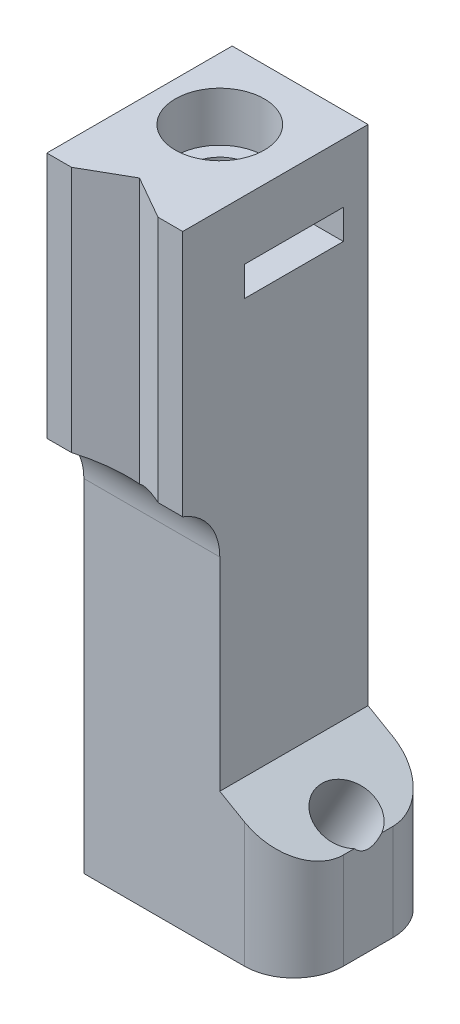
ISO-10303-21;
HEADER;
FILE_DESCRIPTION(('STEP AP214'),'2;1');
FILE_NAME('part.step','',(''),(''),'','','');
FILE_SCHEMA(('AUTOMOTIVE_DESIGN { 1 0 10303 214 1 1 1 1 }'));
ENDSEC;
DATA;
#1=APPLICATION_CONTEXT('core data for automotive mechanical design processes');
#2=APPLICATION_PROTOCOL_DEFINITION('international standard','automotive_design',2000,#1);
#3=PRODUCT_CONTEXT('',#1,'mechanical');
#4=PRODUCT('Part','Part','',(#3));
#5=PRODUCT_RELATED_PRODUCT_CATEGORY('part','',(#4));
#6=PRODUCT_DEFINITION_FORMATION('','',#4);
#7=PRODUCT_DEFINITION_CONTEXT('part definition',#1,'design');
#8=PRODUCT_DEFINITION('design','',#6,#7);
#9=PRODUCT_DEFINITION_SHAPE('','',#8);
#10=(LENGTH_UNIT() NAMED_UNIT(*) SI_UNIT(.MILLI.,.METRE.));
#11=(NAMED_UNIT(*) PLANE_ANGLE_UNIT() SI_UNIT($,.RADIAN.));
#12=(NAMED_UNIT(*) SI_UNIT($,.STERADIAN.) SOLID_ANGLE_UNIT());
#13=UNCERTAINTY_MEASURE_WITH_UNIT(LENGTH_MEASURE(1.E-05),#10,'distance_accuracy_value','');
#14=(GEOMETRIC_REPRESENTATION_CONTEXT(3) GLOBAL_UNCERTAINTY_ASSIGNED_CONTEXT((#13)) GLOBAL_UNIT_ASSIGNED_CONTEXT((#10,
#11,#12)) REPRESENTATION_CONTEXT('',''));
#15=CARTESIAN_POINT('',(0.,0.,0.));
#16=DIRECTION('',(0.,0.,1.));
#17=DIRECTION('',(1.,0.,0.));
#18=AXIS2_PLACEMENT_3D('',#15,#16,#17);
#19=CARTESIAN_POINT('',(2.50000000000003,19.75,0.));
#20=DIRECTION('',(0.,-1.,0.));
#21=DIRECTION('',(1.,0.,0.));
#22=AXIS2_PLACEMENT_3D('',#19,#20,#21);
#23=CYLINDRICAL_SURFACE('',#22,0.605);
#24=CARTESIAN_POINT('',(2.50000000000003,19.55,0.));
#25=DIRECTION('',(0.,1.,0.));
#26=DIRECTION('',(0.,0.,1.));
#27=AXIS2_PLACEMENT_3D('',#24,#25,#26);
#28=CIRCLE('',#27,0.605);
#29=CARTESIAN_POINT('',(2.50000000000003,19.55,0.605000000000023));
#30=VERTEX_POINT('',#29);
#31=EDGE_CURVE('E325',#30,#30,#28,.T.);
#32=ORIENTED_EDGE('',*,*,#31,.F.);
#33=EDGE_LOOP('',(#32));
#34=FACE_BOUND('',#33,.T.);
#35=CARTESIAN_POINT('',(2.50000000000003,19.75,0.));
#36=DIRECTION('',(0.,1.,0.));
#37=DIRECTION('',(-1.,0.,0.));
#38=AXIS2_PLACEMENT_3D('',#35,#36,#37);
#39=CIRCLE('',#38,0.605);
#40=CARTESIAN_POINT('',(1.89500000000003,19.75,0.));
#41=VERTEX_POINT('',#40);
#42=EDGE_CURVE('E361',#41,#41,#39,.T.);
#43=ORIENTED_EDGE('',*,*,#42,.T.);
#44=EDGE_LOOP('',(#43));
#45=FACE_BOUND('',#44,.T.);
#46=ADVANCED_FACE('F39',(#34,#45),#23,.F.);
#47=CARTESIAN_POINT('',(0.,0.,2.24999999996326));
#48=DIRECTION('',(0.,0.,-1.));
#49=DIRECTION('',(-1.,0.,0.));
#50=AXIS2_PLACEMENT_3D('',#47,#48,#49);
#51=PLANE('',#50);
#52=DIRECTION('',(1.,0.,0.));
#53=VECTOR('',#52,1.);
#54=CARTESIAN_POINT('',(4.00000000001019,15.75,2.24999999996326));
#55=LINE('',#54,#53);
#56=CARTESIAN_POINT('',(1.25000000001018,15.75,2.24999999996326));
#57=VERTEX_POINT('',#56);
#58=CARTESIAN_POINT('',(1.75000000001019,15.75,2.24999999996326));
#59=VERTEX_POINT('',#58);
#60=EDGE_CURVE('E380',#57,#59,#55,.T.);
#61=ORIENTED_EDGE('',*,*,#60,.T.);
#62=DIRECTION('',(0.,1.,0.));
#63=VECTOR('',#62,1.);
#64=CARTESIAN_POINT('',(1.75000000001014,0.,2.24999999996326));
#65=LINE('',#64,#63);
#66=CARTESIAN_POINT('',(1.7500000000102,20.75,2.24999999996327));
#67=VERTEX_POINT('',#66);
#68=EDGE_CURVE('E305',#59,#67,#65,.T.);
#69=ORIENTED_EDGE('',*,*,#68,.T.);
#70=DIRECTION('',(-1.,0.,0.));
#71=VECTOR('',#70,1.);
#72=CARTESIAN_POINT('',(4.00000000001018,20.75,2.24999999996326));
#73=LINE('',#72,#71);
#74=CARTESIAN_POINT('',(1.25000000001019,20.75,2.24999999996326));
#75=VERTEX_POINT('',#74);
#76=EDGE_CURVE('E392',#67,#75,#73,.T.);
#77=ORIENTED_EDGE('',*,*,#76,.T.);
#78=DIRECTION('',(0.,-1.,0.));
#79=VECTOR('',#78,1.);
#80=CARTESIAN_POINT('',(1.25000000001019,20.75,2.24999999996326));
#81=LINE('',#80,#79);
#82=EDGE_CURVE('E386',#75,#57,#81,.T.);
#83=ORIENTED_EDGE('',*,*,#82,.T.);
#84=EDGE_LOOP('',(#61,#69,#77,#83));
#85=FACE_BOUND('',#84,.T.);
#86=ADVANCED_FACE('F468',(#85),#51,.F.);
#87=CARTESIAN_POINT('',(0.,19.75,0.));
#88=DIRECTION('',(0.,1.,0.));
#89=DIRECTION('',(-1.,0.,0.));
#90=AXIS2_PLACEMENT_3D('',#87,#88,#89);
#91=PLANE('',#90);
#92=ORIENTED_EDGE('',*,*,#42,.F.);
#93=EDGE_LOOP('',(#92));
#94=FACE_BOUND('',#93,.T.);
#95=CARTESIAN_POINT('',(2.50000000000002,19.75,0.));
#96=DIRECTION('',(0.,1.,0.));
#97=DIRECTION('',(-1.,0.,0.));
#98=AXIS2_PLACEMENT_3D('',#95,#96,#97);
#99=CIRCLE('',#98,0.9);
#100=CARTESIAN_POINT('',(1.60000000000002,19.75,0.));
#101=VERTEX_POINT('',#100);
#102=EDGE_CURVE('E377',#101,#101,#99,.T.);
#103=ORIENTED_EDGE('',*,*,#102,.T.);
#104=EDGE_LOOP('',(#103));
#105=FACE_BOUND('',#104,.T.);
#106=ADVANCED_FACE('F480',(#94,#105),#91,.T.);
#107=CARTESIAN_POINT('',(0.,18.75,0.));
#108=DIRECTION('',(0.,1.,0.));
#109=DIRECTION('',(-1.,0.,0.));
#110=AXIS2_PLACEMENT_3D('',#107,#108,#109);
#111=PLANE('',#110);
#112=CARTESIAN_POINT('',(2.50000000000001,18.75,0.));
#113=DIRECTION('',(0.,1.,0.));
#114=DIRECTION('',(-1.,0.,0.));
#115=AXIS2_PLACEMENT_3D('',#112,#113,#114);
#116=CIRCLE('',#115,0.425);
#117=CARTESIAN_POINT('',(2.07500000000001,18.75,0.));
#118=VERTEX_POINT('',#117);
#119=EDGE_CURVE('E253',#118,#118,#116,.T.);
#120=ORIENTED_EDGE('',*,*,#119,.F.);
#121=EDGE_LOOP('',(#120));
#122=FACE_BOUND('',#121,.T.);
#123=CARTESIAN_POINT('',(2.50000000000003,18.75,0.));
#124=DIRECTION('',(0.,1.,0.));
#125=DIRECTION('',(-1.,0.,0.));
#126=AXIS2_PLACEMENT_3D('',#123,#124,#125);
#127=CIRCLE('',#126,0.605);
#128=CARTESIAN_POINT('',(1.89500000000003,18.75,0.));
#129=VERTEX_POINT('',#128);
#130=EDGE_CURVE('E362',#129,#129,#127,.T.);
#131=ORIENTED_EDGE('',*,*,#130,.T.);
#132=EDGE_LOOP('',(#131));
#133=FACE_BOUND('',#132,.T.);
#134=ADVANCED_FACE('F483',(#122,#133),#111,.T.);
#135=CARTESIAN_POINT('',(1.25000000001017,17.75,1.49999999996326));
#136=DIRECTION('',(-1.,0.,0.));
#137=DIRECTION('',(0.,0.,1.));
#138=AXIS2_PLACEMENT_3D('',#135,#136,#137);
#139=PLANE('',#138);
#140=DIRECTION('',(0.,-1.,0.));
#141=VECTOR('',#140,1.);
#142=CARTESIAN_POINT('',(1.25000000001017,18.95,-0.999999999963246));
#143=LINE('',#142,#141);
#144=CARTESIAN_POINT('',(1.25000000001017,19.55,-0.999999999963246));
#145=VERTEX_POINT('',#144);
#146=CARTESIAN_POINT('',(1.25000000001017,18.95,-0.999999999963245));
#147=VERTEX_POINT('',#146);
#148=EDGE_CURVE('E422',#145,#147,#143,.T.);
#149=ORIENTED_EDGE('',*,*,#148,.F.);
#150=DIRECTION('',(0.,0.,-1.));
#151=VECTOR('',#150,1.);
#152=CARTESIAN_POINT('',(1.25000000001017,19.55,-0.999999999963246));
#153=LINE('',#152,#151);
#154=CARTESIAN_POINT('',(1.25000000001017,19.55,1.00000000003675));
#155=VERTEX_POINT('',#154);
#156=EDGE_CURVE('E409',#155,#145,#153,.T.);
#157=ORIENTED_EDGE('',*,*,#156,.F.);
#158=DIRECTION('',(0.,1.,0.));
#159=VECTOR('',#158,1.);
#160=CARTESIAN_POINT('',(1.25000000001017,18.95,1.00000000003675));
#161=LINE('',#160,#159);
#162=CARTESIAN_POINT('',(1.25000000001017,18.95,1.00000000003675));
#163=VERTEX_POINT('',#162);
#164=EDGE_CURVE('E416',#163,#155,#161,.T.);
#165=ORIENTED_EDGE('',*,*,#164,.F.);
#166=DIRECTION('',(0.,0.,1.));
#167=VECTOR('',#166,1.);
#168=CARTESIAN_POINT('',(1.25000000001017,18.95,-0.999999999963246));
#169=LINE('',#168,#167);
#170=EDGE_CURVE('E419',#147,#163,#169,.T.);
#171=ORIENTED_EDGE('',*,*,#170,.F.);
#172=EDGE_LOOP('',(#149,#157,#165,#171));
#173=FACE_BOUND('',#172,.T.);
#174=DIRECTION('',(0.,0.,-1.));
#175=VECTOR('',#174,1.);
#176=CARTESIAN_POINT('',(1.25000000001017,7.75,1.49999999996326));
#177=LINE('',#176,#175);
#178=CARTESIAN_POINT('',(1.25000000001017,7.75,-0.580511210533454));
#179=VERTEX_POINT('',#178);
#180=CARTESIAN_POINT('',(1.25000000001017,7.75,-1.50000000003674));
#181=VERTEX_POINT('',#180);
#182=EDGE_CURVE('E256',#179,#181,#177,.T.);
#183=ORIENTED_EDGE('',*,*,#182,.F.);
#184=DIRECTION('',(0.,1.,0.));
#185=VECTOR('',#184,1.);
#186=CARTESIAN_POINT('',(1.25000000001017,17.75,-0.580511210533454));
#187=LINE('',#186,#185);
#188=CARTESIAN_POINT('',(1.25000000001017,17.75,-0.580511210533454));
#189=VERTEX_POINT('',#188);
#190=EDGE_CURVE('E249',#179,#189,#187,.T.);
#191=ORIENTED_EDGE('',*,*,#190,.T.);
#192=DIRECTION('',(0.,0.,1.));
#193=VECTOR('',#192,1.);
#194=CARTESIAN_POINT('',(1.25000000001017,17.75,1.49999999996326));
#195=LINE('',#194,#193);
#196=CARTESIAN_POINT('',(1.25000000001017,17.75,0.580511210533455));
#197=VERTEX_POINT('',#196);
#198=EDGE_CURVE('E281',#189,#197,#195,.T.);
#199=ORIENTED_EDGE('',*,*,#198,.T.);
#200=DIRECTION('',(0.,-1.,0.));
#201=VECTOR('',#200,1.);
#202=CARTESIAN_POINT('',(1.25000000001017,17.75,0.580511210533455));
#203=LINE('',#202,#201);
#204=CARTESIAN_POINT('',(1.25000000001017,7.75,0.580511210533455));
#205=VERTEX_POINT('',#204);
#206=EDGE_CURVE('E241',#197,#205,#203,.T.);
#207=ORIENTED_EDGE('',*,*,#206,.T.);
#208=CARTESIAN_POINT('',(1.25000000001017,7.75,1.49999999996326));
#209=VERTEX_POINT('',#208);
#210=EDGE_CURVE('E257',#209,#205,#177,.T.);
#211=ORIENTED_EDGE('',*,*,#210,.F.);
#212=DIRECTION('',(0.,-1.,0.));
#213=VECTOR('',#212,1.);
#214=CARTESIAN_POINT('',(1.25000000001017,17.75,1.49999999996326));
#215=LINE('',#214,#213);
#216=CARTESIAN_POINT('',(1.25000000001017,14.6718070673576,1.49999999996326));
#217=VERTEX_POINT('',#216);
#218=EDGE_CURVE('E266',#217,#209,#215,.T.);
#219=ORIENTED_EDGE('',*,*,#218,.F.);
#220=CARTESIAN_POINT('',(1.25000000001017,14.6718070673576,2.64999999996326));
#221=DIRECTION('',(-1.,0.,0.));
#222=DIRECTION('',(0.,0.,1.));
#223=AXIS2_PLACEMENT_3D('',#220,#221,#222);
#224=CIRCLE('',#223,1.15);
#225=EDGE_CURVE('E317',#217,#57,#224,.F.);
#226=ORIENTED_EDGE('',*,*,#225,.T.);
#227=ORIENTED_EDGE('',*,*,#82,.F.);
#228=DIRECTION('',(0.,0.,1.));
#229=VECTOR('',#228,1.);
#230=CARTESIAN_POINT('',(1.25000000001019,20.75,-1.49999999996325));
#231=LINE('',#230,#229);
#232=CARTESIAN_POINT('',(1.25000000001019,20.75,-1.49999999996325));
#233=VERTEX_POINT('',#232);
#234=EDGE_CURVE('E365',#233,#75,#231,.T.);
#235=ORIENTED_EDGE('',*,*,#234,.F.);
#236=DIRECTION('',(0.,-1.,0.));
#237=VECTOR('',#236,1.);
#238=CARTESIAN_POINT('',(1.25000000001017,17.75,-1.50000000003674));
#239=LINE('',#238,#237);
#240=EDGE_CURVE('E265',#233,#181,#239,.T.);
#241=ORIENTED_EDGE('',*,*,#240,.T.);
#242=EDGE_LOOP('',(#183,#191,#199,#207,#211,#219,#226,#227,#235,#241));
#243=FACE_BOUND('',#242,.T.);
#244=ADVANCED_FACE('F541',(#173,#243),#139,.T.);
#245=CARTESIAN_POINT('',(0.,7.75,0.));
#246=DIRECTION('',(0.,1.,0.));
#247=DIRECTION('',(0.,0.,1.));
#248=AXIS2_PLACEMENT_3D('',#245,#246,#247);
#249=PLANE('',#248);
#250=CARTESIAN_POINT('',(2.5,7.75,0.));
#251=DIRECTION('',(0.,1.,0.));
#252=DIRECTION('',(0.,0.,-1.));
#253=AXIS2_PLACEMENT_3D('',#250,#251,#252);
#254=CIRCLE('',#253,0.824999999999999);
#255=CARTESIAN_POINT('',(1.90709641996474,7.75,0.573663965036469));
#256=VERTEX_POINT('',#255);
#257=CARTESIAN_POINT('',(3.25386128245776,7.75,0.335139026093853));
#258=VERTEX_POINT('',#257);
#259=EDGE_CURVE('E242',#256,#258,#254,.T.);
#260=ORIENTED_EDGE('',*,*,#259,.T.);
#261=CARTESIAN_POINT('',(3.79337567298423,7.75,0.));
#262=DIRECTION('',(0.,1.,0.));
#263=DIRECTION('',(1.,0.,0.));
#264=AXIS2_PLACEMENT_3D('',#261,#262,#263);
#265=ELLIPSE('',#264,0.663952809568066,0.575);
#266=CARTESIAN_POINT('',(3.25386128245776,7.75,-0.335139026093852));
#267=VERTEX_POINT('',#266);
#268=EDGE_CURVE('E53',#258,#267,#265,.T.);
#269=ORIENTED_EDGE('',*,*,#268,.T.);
#270=CARTESIAN_POINT('',(1.90709641996474,7.75,-0.573663965036468));
#271=VERTEX_POINT('',#270);
#272=EDGE_CURVE('E245',#267,#271,#254,.T.);
#273=ORIENTED_EDGE('',*,*,#272,.T.);
#274=CARTESIAN_POINT('',(1.76336221874407,7.75,-0.712734017166522));
#275=DIRECTION('',(0.,1.,0.));
#276=DIRECTION('',(0.,0.,1.));
#277=AXIS2_PLACEMENT_3D('',#274,#275,#276);
#278=CIRCLE('',#277,0.2);
#279=CARTESIAN_POINT('',(1.73648991010204,7.75,-0.514547541774664));
#280=VERTEX_POINT('',#279);
#281=EDGE_CURVE('E291',#271,#280,#278,.F.);
#282=ORIENTED_EDGE('',*,*,#281,.T.);
#283=DIRECTION('',(-0.990932376959291,0.,-0.134361543210136));
#284=VECTOR('',#283,1.);
#285=CARTESIAN_POINT('',(0.,7.75,-0.75));
#286=LINE('',#285,#284);
#287=EDGE_CURVE('E236',#280,#179,#286,.T.);
#288=ORIENTED_EDGE('',*,*,#287,.T.);
#289=ORIENTED_EDGE('',*,*,#182,.T.);
#290=DIRECTION('',(1.,0.,2.67195514451353E-11));
#291=VECTOR('',#290,1.);
#292=CARTESIAN_POINT('',(4.00000000001017,7.75,-1.49999999996326));
#293=LINE('',#292,#291);
#294=CARTESIAN_POINT('',(4.50000000003691,7.75,-1.4999999999499));
#295=VERTEX_POINT('',#294);
#296=EDGE_CURVE('E260',#181,#295,#293,.T.);
#297=ORIENTED_EDGE('',*,*,#296,.T.);
#298=CARTESIAN_POINT('',(4.50000000001019,7.75,-0.499999999949901));
#299=DIRECTION('',(0.,1.,0.));
#300=DIRECTION('',(0.,0.,1.));
#301=AXIS2_PLACEMENT_3D('',#298,#299,#300);
#302=CIRCLE('',#301,1.);
#303=CARTESIAN_POINT('',(5.50000000001019,7.75,-0.499999999949901));
#304=VERTEX_POINT('',#303);
#305=EDGE_CURVE('E47',#295,#304,#302,.F.);
#306=ORIENTED_EDGE('',*,*,#305,.T.);
#307=DIRECTION('',(0.,0.,1.));
#308=VECTOR('',#307,1.);
#309=CARTESIAN_POINT('',(5.50000000001019,7.75,-4.69061108165771));
#310=LINE('',#309,#308);
#311=CARTESIAN_POINT('',(5.50000000001019,7.75,0.499999999963262));
#312=VERTEX_POINT('',#311);
#313=EDGE_CURVE('E222',#304,#312,#310,.T.);
#314=ORIENTED_EDGE('',*,*,#313,.T.);
#315=CARTESIAN_POINT('',(4.50000000001019,7.75,0.499999999963261));
#316=DIRECTION('',(0.,1.,0.));
#317=DIRECTION('',(0.,0.,1.));
#318=AXIS2_PLACEMENT_3D('',#315,#316,#317);
#319=CIRCLE('',#318,1.);
#320=CARTESIAN_POINT('',(4.50000000001019,7.75,1.49999999996326));
#321=VERTEX_POINT('',#320);
#322=EDGE_CURVE('E342',#312,#321,#319,.F.);
#323=ORIENTED_EDGE('',*,*,#322,.T.);
#324=DIRECTION('',(-1.,0.,0.));
#325=VECTOR('',#324,1.);
#326=CARTESIAN_POINT('',(4.00000000001017,7.75,1.49999999996326));
#327=LINE('',#326,#325);
#328=EDGE_CURVE('E263',#321,#209,#327,.T.);
#329=ORIENTED_EDGE('',*,*,#328,.T.);
#330=ORIENTED_EDGE('',*,*,#210,.T.);
#331=DIRECTION('',(-0.990932376959291,0.,0.134361543210136));
#332=VECTOR('',#331,1.);
#333=CARTESIAN_POINT('',(0.0998574025388538,7.75,0.736460231779643));
#334=LINE('',#333,#332);
#335=CARTESIAN_POINT('',(1.73648991010204,7.75,0.514547541774664));
#336=VERTEX_POINT('',#335);
#337=EDGE_CURVE('E269',#336,#205,#334,.T.);
#338=ORIENTED_EDGE('',*,*,#337,.F.);
#339=CARTESIAN_POINT('',(1.76336221874407,7.75,0.712734017166523));
#340=DIRECTION('',(0.,1.,0.));
#341=DIRECTION('',(0.,0.,1.));
#342=AXIS2_PLACEMENT_3D('',#339,#340,#341);
#343=CIRCLE('',#342,0.2);
#344=EDGE_CURVE('E289',#336,#256,#343,.F.);
#345=ORIENTED_EDGE('',*,*,#344,.T.);
#346=EDGE_LOOP('',(#260,#269,#273,#282,#288,#289,#297,#306,#314,#323,#329,#330,#338,#345));
#347=FACE_BOUND('',#346,.T.);
#348=ADVANCED_FACE('F346',(#347),#249,.F.);
#349=CARTESIAN_POINT('',(4.00000000001017,17.75,1.49999999996326));
#350=DIRECTION('',(0.,0.,1.));
#351=DIRECTION('',(1.,0.,0.));
#352=AXIS2_PLACEMENT_3D('',#349,#350,#351);
#353=PLANE('',#352);
#354=ORIENTED_EDGE('',*,*,#328,.F.);
#355=DIRECTION('',(0.,1.,0.));
#356=VECTOR('',#355,1.);
#357=CARTESIAN_POINT('',(4.50000000001019,17.75,1.49999999996326));
#358=LINE('',#357,#356);
#359=CARTESIAN_POINT('',(4.50000000001019,10.2773502691896,1.49999999996326));
#360=VERTEX_POINT('',#359);
#361=EDGE_CURVE('E11',#321,#360,#358,.T.);
#362=ORIENTED_EDGE('',*,*,#361,.T.);
#363=DIRECTION('',(-0.866025403784443,0.499999999999993,0.));
#364=VECTOR('',#363,1.);
#365=CARTESIAN_POINT('',(5.5000000000102,9.7,1.49999999996326));
#366=LINE('',#365,#364);
#367=CARTESIAN_POINT('',(4.00000000001018,10.5660254037844,1.49999999996326));
#368=VERTEX_POINT('',#367);
#369=EDGE_CURVE('E226',#360,#368,#366,.T.);
#370=ORIENTED_EDGE('',*,*,#369,.T.);
#371=DIRECTION('',(0.,-1.,0.));
#372=VECTOR('',#371,1.);
#373=CARTESIAN_POINT('',(4.00000000001017,17.75,1.49999999996326));
#374=LINE('',#373,#372);
#375=CARTESIAN_POINT('',(4.00000000001017,14.6718070673576,1.49999999996326));
#376=VERTEX_POINT('',#375);
#377=EDGE_CURVE('E270',#376,#368,#374,.T.);
#378=ORIENTED_EDGE('',*,*,#377,.F.);
#379=DIRECTION('',(1.,0.,0.));
#380=VECTOR('',#379,1.);
#381=CARTESIAN_POINT('',(1.25000000001017,14.6718070673576,1.49999999996326));
#382=LINE('',#381,#380);
#383=EDGE_CURVE('E308',#376,#217,#382,.F.);
#384=ORIENTED_EDGE('',*,*,#383,.T.);
#385=ORIENTED_EDGE('',*,*,#218,.T.);
#386=EDGE_LOOP('',(#354,#362,#370,#378,#384,#385));
#387=FACE_BOUND('',#386,.T.);
#388=ADVANCED_FACE('F546',(#387),#353,.T.);
#389=CARTESIAN_POINT('',(4.00000000001017,17.75,1.49999999996326));
#390=DIRECTION('',(1.,0.,0.));
#391=DIRECTION('',(0.,0.,-1.));
#392=AXIS2_PLACEMENT_3D('',#389,#390,#391);
#393=PLANE('',#392);
#394=DIRECTION('',(0.,1.,0.));
#395=VECTOR('',#394,1.);
#396=CARTESIAN_POINT('',(4.00000000001017,17.75,-0.999999999963246));
#397=LINE('',#396,#395);
#398=CARTESIAN_POINT('',(4.00000000001017,18.95,-0.999999999963246));
#399=VERTEX_POINT('',#398);
#400=CARTESIAN_POINT('',(4.00000000001017,19.55,-0.999999999963246));
#401=VERTEX_POINT('',#400);
#402=EDGE_CURVE('E331',#399,#401,#397,.T.);
#403=ORIENTED_EDGE('',*,*,#402,.F.);
#404=DIRECTION('',(0.,0.,-1.));
#405=VECTOR('',#404,1.);
#406=CARTESIAN_POINT('',(4.00000000001017,18.95,1.49999999996326));
#407=LINE('',#406,#405);
#408=CARTESIAN_POINT('',(4.00000000001017,18.95,1.00000000003675));
#409=VERTEX_POINT('',#408);
#410=EDGE_CURVE('E323',#409,#399,#407,.T.);
#411=ORIENTED_EDGE('',*,*,#410,.F.);
#412=DIRECTION('',(0.,-1.,0.));
#413=VECTOR('',#412,1.);
#414=CARTESIAN_POINT('',(4.00000000001017,17.75,1.00000000003675));
#415=LINE('',#414,#413);
#416=CARTESIAN_POINT('',(4.00000000001017,19.55,1.00000000003675));
#417=VERTEX_POINT('',#416);
#418=EDGE_CURVE('E319',#417,#409,#415,.T.);
#419=ORIENTED_EDGE('',*,*,#418,.F.);
#420=DIRECTION('',(0.,0.,1.));
#421=VECTOR('',#420,1.);
#422=CARTESIAN_POINT('',(4.00000000001017,19.55,1.49999999996326));
#423=LINE('',#422,#421);
#424=EDGE_CURVE('E328',#401,#417,#423,.T.);
#425=ORIENTED_EDGE('',*,*,#424,.F.);
#426=EDGE_LOOP('',(#403,#411,#419,#425));
#427=FACE_BOUND('',#426,.T.);
#428=DIRECTION('',(0.,0.,1.));
#429=VECTOR('',#428,1.);
#430=CARTESIAN_POINT('',(4.00000000001018,10.5660254037844,-4.69061108165771));
#431=LINE('',#430,#429);
#432=CARTESIAN_POINT('',(4.00000000001017,10.5660254037844,-1.49999999996326));
#433=VERTEX_POINT('',#432);
#434=EDGE_CURVE('E229',#433,#368,#431,.T.);
#435=ORIENTED_EDGE('',*,*,#434,.F.);
#436=DIRECTION('',(0.,-1.,0.));
#437=VECTOR('',#436,1.);
#438=CARTESIAN_POINT('',(4.00000000001017,17.75,-1.49999999996326));
#439=LINE('',#438,#437);
#440=CARTESIAN_POINT('',(4.00000000001019,20.75,-1.49999999996325));
#441=VERTEX_POINT('',#440);
#442=EDGE_CURVE('E273',#441,#433,#439,.T.);
#443=ORIENTED_EDGE('',*,*,#442,.F.);
#444=DIRECTION('',(0.,0.,-1.));
#445=VECTOR('',#444,1.);
#446=CARTESIAN_POINT('',(4.00000000001019,20.75,-1.49999999996325));
#447=LINE('',#446,#445);
#448=CARTESIAN_POINT('',(4.00000000001018,20.75,2.24999999996326));
#449=VERTEX_POINT('',#448);
#450=EDGE_CURVE('E373',#449,#441,#447,.T.);
#451=ORIENTED_EDGE('',*,*,#450,.F.);
#452=DIRECTION('',(0.,1.,0.));
#453=VECTOR('',#452,1.);
#454=CARTESIAN_POINT('',(4.00000000001018,20.75,2.24999999996326));
#455=LINE('',#454,#453);
#456=CARTESIAN_POINT('',(4.00000000001019,15.75,2.24999999996326));
#457=VERTEX_POINT('',#456);
#458=EDGE_CURVE('E393',#457,#449,#455,.T.);
#459=ORIENTED_EDGE('',*,*,#458,.F.);
#460=CARTESIAN_POINT('',(4.00000000001017,14.6718070673576,2.64999999996326));
#461=DIRECTION('',(1.,0.,0.));
#462=DIRECTION('',(0.,0.,-1.));
#463=AXIS2_PLACEMENT_3D('',#460,#461,#462);
#464=CIRCLE('',#463,1.15);
#465=EDGE_CURVE('E315',#457,#376,#464,.F.);
#466=ORIENTED_EDGE('',*,*,#465,.T.);
#467=ORIENTED_EDGE('',*,*,#377,.T.);
#468=EDGE_LOOP('',(#435,#443,#451,#459,#466,#467));
#469=FACE_BOUND('',#468,.T.);
#470=ADVANCED_FACE('F552',(#427,#469),#393,.T.);
#471=CARTESIAN_POINT('',(4.00000000001017,17.75,-1.49999999996326));
#472=DIRECTION('',(2.67195514451353E-11,0.,-1.));
#473=DIRECTION('',(-1.,0.,-2.67195514451353E-11));
#474=AXIS2_PLACEMENT_3D('',#471,#472,#473);
#475=PLANE('',#474);
#476=DIRECTION('',(-0.866025403784443,0.499999999999993,-2.31398103292125E-11));
#477=VECTOR('',#476,1.);
#478=CARTESIAN_POINT('',(5.49999999994626,9.70000000003692,-1.49999999992318));
#479=LINE('',#478,#477);
#480=CARTESIAN_POINT('',(4.50000000003691,10.2773502691742,-1.4999999999499));
#481=VERTEX_POINT('',#480);
#482=EDGE_CURVE('E224',#481,#433,#479,.T.);
#483=ORIENTED_EDGE('',*,*,#482,.F.);
#484=DIRECTION('',(0.,1.,0.));
#485=VECTOR('',#484,1.);
#486=CARTESIAN_POINT('',(4.50000000003691,17.75,-1.4999999999499));
#487=LINE('',#486,#485);
#488=EDGE_CURVE('E340',#481,#295,#487,.F.);
#489=ORIENTED_EDGE('',*,*,#488,.T.);
#490=ORIENTED_EDGE('',*,*,#296,.F.);
#491=ORIENTED_EDGE('',*,*,#240,.F.);
#492=DIRECTION('',(-1.,0.,0.));
#493=VECTOR('',#492,1.);
#494=CARTESIAN_POINT('',(4.00000000001019,20.75,-1.49999999996325));
#495=LINE('',#494,#493);
#496=EDGE_CURVE('E370',#441,#233,#495,.T.);
#497=ORIENTED_EDGE('',*,*,#496,.F.);
#498=ORIENTED_EDGE('',*,*,#442,.T.);
#499=EDGE_LOOP('',(#483,#489,#490,#491,#497,#498));
#500=FACE_BOUND('',#499,.T.);
#501=ADVANCED_FACE('F357',(#500),#475,.T.);
#502=CARTESIAN_POINT('',(2.50000000000001,18.75,0.));
#503=DIRECTION('',(0.,-1.,0.));
#504=DIRECTION('',(1.,0.,0.));
#505=AXIS2_PLACEMENT_3D('',#502,#503,#504);
#506=CYLINDRICAL_SURFACE('',#505,0.425);
#507=ORIENTED_EDGE('',*,*,#119,.T.);
#508=EDGE_LOOP('',(#507));
#509=FACE_BOUND('',#508,.T.);
#510=CARTESIAN_POINT('',(2.50000000000001,17.75,0.));
#511=DIRECTION('',(0.,1.,0.));
#512=DIRECTION('',(0.,0.,1.));
#513=AXIS2_PLACEMENT_3D('',#510,#511,#512);
#514=CIRCLE('',#513,0.425);
#515=CARTESIAN_POINT('',(2.50000000000001,17.75,0.425000000000002));
#516=VERTEX_POINT('',#515);
#517=EDGE_CURVE('E252',#516,#516,#514,.F.);
#518=ORIENTED_EDGE('',*,*,#517,.T.);
#519=EDGE_LOOP('',(#518));
#520=FACE_BOUND('',#519,.T.);
#521=ADVANCED_FACE('F505',(#509,#520),#506,.F.);
#522=CARTESIAN_POINT('',(2.5,17.75,0.));
#523=DIRECTION('',(0.,-1.,0.));
#524=DIRECTION('',(0.,0.,-1.));
#525=AXIS2_PLACEMENT_3D('',#522,#523,#524);
#526=CYLINDRICAL_SURFACE('',#525,0.824999999999999);
#527=CARTESIAN_POINT('',(3.25386128245776,7.75,0.335139026093853));
#528=CARTESIAN_POINT('',(3.25811827945143,7.77111145134007,0.32554148059474));
#529=CARTESIAN_POINT('',(3.26237618985324,7.79203851414726,0.315490895272771));
#530=CARTESIAN_POINT('',(3.27087060163928,7.83346444112072,0.294143706094101));
#531=CARTESIAN_POINT('',(3.27510666885029,7.85395862240085,0.282837894462469));
#532=CARTESIAN_POINT('',(3.28365867745061,7.89504882720899,0.258226700738958));
#533=CARTESIAN_POINT('',(3.28796923505354,7.91560562627378,0.244852971195865));
#534=CARTESIAN_POINT('',(3.29633558540741,7.95525746882288,0.216100636082205));
#535=CARTESIAN_POINT('',(3.30039223893617,7.97435750521167,0.200729416591834));
#536=CARTESIAN_POINT('',(3.3068811786802,8.00475583811144,0.172365461038508));
#537=CARTESIAN_POINT('',(3.30943325103671,8.01666468819849,0.160062926805975));
#538=CARTESIAN_POINT('',(3.31415936947011,8.03865387144431,0.133955802069157));
#539=CARTESIAN_POINT('',(3.31633608493243,8.04874714052105,0.120163058618312));
#540=CARTESIAN_POINT('',(3.31949670108628,8.06337210909149,0.0956487923371605));
#541=CARTESIAN_POINT('',(3.3206380138845,8.06864369968799,0.0853948313894527));
#542=CARTESIAN_POINT('',(3.32257028030641,8.07755972822864,0.0641595159964623));
#543=CARTESIAN_POINT('',(3.32336147927492,8.0812053056277,0.0531786771391697));
#544=CARTESIAN_POINT('',(3.32451106354808,8.08649985099804,0.0305834067615678));
#545=CARTESIAN_POINT('',(3.32486475076176,8.08812714672857,0.0189634739441503));
#546=CARTESIAN_POINT('',(3.32507075738345,8.08907515740627,-0.00437514955612568));
#547=CARTESIAN_POINT('',(3.32492327601952,8.08839678891716,-0.0160937991488196));
#548=CARTESIAN_POINT('',(3.32420599420556,8.08509483171219,-0.0375262797973905));
#549=CARTESIAN_POINT('',(3.32369887705464,8.08275994627251,-0.0472892373627826));
#550=CARTESIAN_POINT('',(3.32238349803524,8.07669752546358,-0.0663453282431114));
#551=CARTESIAN_POINT('',(3.32157510025383,8.07296936156009,-0.0756382473634508));
#552=CARTESIAN_POINT('',(3.31915992515662,8.06181618546568,-0.0990567266198876));
#553=CARTESIAN_POINT('',(3.31736498722118,8.05351449699766,-0.112742182378177));
#554=CARTESIAN_POINT('',(3.31336855309429,8.03497759042128,-0.138670077205081));
#555=CARTESIAN_POINT('',(3.31116570433568,8.02473593703016,-0.150907486786668));
#556=CARTESIAN_POINT('',(3.30435312281886,7.9929546603496,-0.184834268167632));
#557=CARTESIAN_POINT('',(3.29939752035186,7.96970764985597,-0.204830208753249));
#558=CARTESIAN_POINT('',(3.28906892407751,7.92085898946442,-0.241571322608408));
#559=CARTESIAN_POINT('',(3.28369431237605,7.89524813437458,-0.25830292315606));
#560=CARTESIAN_POINT('',(3.27421193936738,7.84963382590647,-0.285248119484465));
#561=CARTESIAN_POINT('',(3.27014588007999,7.82994285917185,-0.29601403176555));
#562=CARTESIAN_POINT('',(3.26200673466995,7.79022219707945,-0.316365288634047));
#563=CARTESIAN_POINT('',(3.25793414959498,7.77019805751701,-0.325961622383702));
#564=CARTESIAN_POINT('',(3.25386128245776,7.75,-0.335139026093852));
#565=B_SPLINE_CURVE_WITH_KNOTS('',3,(#527,#528,#529,#530,#531,#532,#533,#534,#535,#536,#537,
#538,#539,#540,#541,#542,#543,#544,#545,#546,#547,#548,#549,#550,#551,#552,#553,#554,#555,#556,
#557,#558,#559,#560,#561,#562,#563,#564),.UNSPECIFIED.,.F.,.F.,(4,2,2,2,2,2,2,2,2,2,2,2,2,2,2,2,
2,2,4),(0.,0.0707590786088178,0.142076599835266,0.216696383892076,0.291047707088388,
0.342874159646891,0.394315307428962,0.428961111740477,0.463582599154878,0.498572719615468,
0.533548932186498,0.563578103031047,0.593620836986706,0.641661779813972,0.689864967823448,
0.782531021828777,0.875574521702547,0.943962360776453,1.01164783934956),.UNSPECIFIED.);
#566=EDGE_CURVE('E216',#258,#267,#565,.T.);
#567=ORIENTED_EDGE('',*,*,#566,.F.);
#568=ORIENTED_EDGE('',*,*,#259,.F.);
#569=DIRECTION('',(0.,-1.,0.));
#570=VECTOR('',#569,1.);
#571=CARTESIAN_POINT('',(1.90709641996474,17.75,0.573663965036469));
#572=LINE('',#571,#570);
#573=CARTESIAN_POINT('',(1.90709641996474,17.75,0.573663965036469));
#574=VERTEX_POINT('',#573);
#575=EDGE_CURVE('E284',#256,#574,#572,.F.);
#576=ORIENTED_EDGE('',*,*,#575,.T.);
#577=CARTESIAN_POINT('',(2.5,17.75,0.));
#578=DIRECTION('',(0.,1.,0.));
#579=DIRECTION('',(0.,0.,-1.));
#580=AXIS2_PLACEMENT_3D('',#577,#578,#579);
#581=CIRCLE('',#580,0.824999999999999);
#582=CARTESIAN_POINT('',(1.90709641996474,17.75,-0.573663965036468));
#583=VERTEX_POINT('',#582);
#584=EDGE_CURVE('E232',#574,#583,#581,.T.);
#585=ORIENTED_EDGE('',*,*,#584,.T.);
#586=DIRECTION('',(0.,-1.,0.));
#587=VECTOR('',#586,1.);
#588=CARTESIAN_POINT('',(1.90709641996474,17.75,-0.573663965036468));
#589=LINE('',#588,#587);
#590=EDGE_CURVE('E286',#583,#271,#589,.T.);
#591=ORIENTED_EDGE('',*,*,#590,.T.);
#592=ORIENTED_EDGE('',*,*,#272,.F.);
#593=EDGE_LOOP('',(#567,#568,#576,#585,#591,#592));
#594=FACE_BOUND('',#593,.T.);
#595=ADVANCED_FACE('F431',(#594),#526,.F.);
#596=CARTESIAN_POINT('',(0.,17.75,-0.75));
#597=DIRECTION('',(-0.134361543210136,0.,0.990932376959291));
#598=DIRECTION('',(0.990932376959291,0.,0.134361543210136));
#599=AXIS2_PLACEMENT_3D('',#596,#597,#598);
#600=PLANE('',#599);
#601=ORIENTED_EDGE('',*,*,#287,.F.);
#602=DIRECTION('',(0.,-1.,0.));
#603=VECTOR('',#602,1.);
#604=CARTESIAN_POINT('',(1.73648991010204,17.75,-0.514547541774664));
#605=LINE('',#604,#603);
#606=CARTESIAN_POINT('',(1.73648991010204,17.75,-0.514547541774664));
#607=VERTEX_POINT('',#606);
#608=EDGE_CURVE('E293',#280,#607,#605,.F.);
#609=ORIENTED_EDGE('',*,*,#608,.T.);
#610=DIRECTION('',(-0.990932376959291,0.,-0.134361543210136));
#611=VECTOR('',#610,1.);
#612=CARTESIAN_POINT('',(0.,17.75,-0.75));
#613=LINE('',#612,#611);
#614=EDGE_CURVE('E235',#607,#189,#613,.T.);
#615=ORIENTED_EDGE('',*,*,#614,.T.);
#616=ORIENTED_EDGE('',*,*,#190,.F.);
#617=EDGE_LOOP('',(#601,#609,#615,#616));
#618=FACE_BOUND('',#617,.T.);
#619=ADVANCED_FACE('F497',(#618),#600,.T.);
#620=CARTESIAN_POINT('',(0.,17.75,0.75));
#621=DIRECTION('',(-0.134361543210136,0.,-0.990932376959291));
#622=DIRECTION('',(-0.990932376959291,0.,0.134361543210136));
#623=AXIS2_PLACEMENT_3D('',#620,#621,#622);
#624=PLANE('',#623);
#625=DIRECTION('',(0.990932376959291,0.,-0.134361543210136));
#626=VECTOR('',#625,1.);
#627=CARTESIAN_POINT('',(0.,17.75,0.75));
#628=LINE('',#627,#626);
#629=CARTESIAN_POINT('',(1.73648991010204,17.75,0.514547541774664));
#630=VERTEX_POINT('',#629);
#631=EDGE_CURVE('E238',#197,#630,#628,.T.);
#632=ORIENTED_EDGE('',*,*,#631,.T.);
#633=DIRECTION('',(0.,-1.,0.));
#634=VECTOR('',#633,1.);
#635=CARTESIAN_POINT('',(1.73648991010204,17.75,0.514547541774664));
#636=LINE('',#635,#634);
#637=EDGE_CURVE('E295',#630,#336,#636,.T.);
#638=ORIENTED_EDGE('',*,*,#637,.T.);
#639=ORIENTED_EDGE('',*,*,#337,.T.);
#640=ORIENTED_EDGE('',*,*,#206,.F.);
#641=EDGE_LOOP('',(#632,#638,#639,#640));
#642=FACE_BOUND('',#641,.T.);
#643=ADVANCED_FACE('F494',(#642),#624,.T.);
#644=CARTESIAN_POINT('',(2.5,17.75,0.));
#645=DIRECTION('',(0.,-1.,0.));
#646=DIRECTION('',(0.,0.,-1.));
#647=AXIS2_PLACEMENT_3D('',#644,#645,#646);
#648=PLANE('',#647);
#649=ORIENTED_EDGE('',*,*,#517,.F.);
#650=EDGE_LOOP('',(#649));
#651=FACE_BOUND('',#650,.T.);
#652=ORIENTED_EDGE('',*,*,#614,.F.);
#653=CARTESIAN_POINT('',(1.76336221874407,17.75,-0.712734017166522));
#654=DIRECTION('',(0.,-1.,0.));
#655=DIRECTION('',(0.,0.,-1.));
#656=AXIS2_PLACEMENT_3D('',#653,#654,#655);
#657=CIRCLE('',#656,0.2);
#658=EDGE_CURVE('E298',#607,#583,#657,.F.);
#659=ORIENTED_EDGE('',*,*,#658,.T.);
#660=ORIENTED_EDGE('',*,*,#584,.F.);
#661=CARTESIAN_POINT('',(1.76336221874407,17.75,0.712734017166523));
#662=DIRECTION('',(0.,-1.,0.));
#663=DIRECTION('',(0.,0.,-1.));
#664=AXIS2_PLACEMENT_3D('',#661,#662,#663);
#665=CIRCLE('',#664,0.2);
#666=EDGE_CURVE('E300',#574,#630,#665,.F.);
#667=ORIENTED_EDGE('',*,*,#666,.T.);
#668=ORIENTED_EDGE('',*,*,#631,.F.);
#669=ORIENTED_EDGE('',*,*,#198,.F.);
#670=EDGE_LOOP('',(#652,#659,#660,#667,#668,#669));
#671=FACE_BOUND('',#670,.T.);
#672=ADVANCED_FACE('F490',(#651,#671),#648,.T.);
#673=CARTESIAN_POINT('',(1.76336221874407,17.75,-0.712734017166522));
#674=DIRECTION('',(0.,-1.,0.));
#675=DIRECTION('',(0.,0.,-1.));
#676=AXIS2_PLACEMENT_3D('',#673,#674,#675);
#677=CYLINDRICAL_SURFACE('',#676,0.2);
#678=ORIENTED_EDGE('',*,*,#658,.F.);
#679=ORIENTED_EDGE('',*,*,#608,.F.);
#680=ORIENTED_EDGE('',*,*,#281,.F.);
#681=ORIENTED_EDGE('',*,*,#590,.F.);
#682=EDGE_LOOP('',(#678,#679,#680,#681));
#683=FACE_BOUND('',#682,.T.);
#684=ADVANCED_FACE('F493',(#683),#677,.T.);
#685=CARTESIAN_POINT('',(1.76336221874407,17.75,0.712734017166523));
#686=DIRECTION('',(0.,-1.,0.));
#687=DIRECTION('',(0.,0.,-1.));
#688=AXIS2_PLACEMENT_3D('',#685,#686,#687);
#689=CYLINDRICAL_SURFACE('',#688,0.2);
#690=ORIENTED_EDGE('',*,*,#666,.F.);
#691=ORIENTED_EDGE('',*,*,#575,.F.);
#692=ORIENTED_EDGE('',*,*,#344,.F.);
#693=ORIENTED_EDGE('',*,*,#637,.F.);
#694=EDGE_LOOP('',(#690,#691,#692,#693));
#695=FACE_BOUND('',#694,.T.);
#696=ADVANCED_FACE('F489',(#695),#689,.T.);
#697=CARTESIAN_POINT('',(5.50000000001019,7.75,-4.69061108165771));
#698=DIRECTION('',(1.,0.,0.));
#699=DIRECTION('',(0.,0.,-1.));
#700=AXIS2_PLACEMENT_3D('',#697,#698,#699);
#701=PLANE('',#700);
#702=CARTESIAN_POINT('',(5.50000000001019,10.7059600438421,0.));
#703=DIRECTION('',(1.,0.,0.));
#704=DIRECTION('',(0.,1.,0.));
#705=AXIS2_PLACEMENT_3D('',#702,#703,#704);
#706=ELLIPSE('',#705,1.15000000000002,0.575);
#707=CARTESIAN_POINT('',(5.50000000001019,9.7,0.278632549333932));
#708=VERTEX_POINT('',#707);
#709=CARTESIAN_POINT('',(5.50000000001019,9.7,-0.278632549333932));
#710=VERTEX_POINT('',#709);
#711=EDGE_CURVE('E60',#708,#710,#706,.T.);
#712=ORIENTED_EDGE('',*,*,#711,.F.);
#713=DIRECTION('',(0.,0.,1.));
#714=VECTOR('',#713,1.);
#715=CARTESIAN_POINT('',(5.50000000001019,9.7,-4.69061108165771));
#716=LINE('',#715,#714);
#717=CARTESIAN_POINT('',(5.50000000001019,9.7,0.499999999963262));
#718=VERTEX_POINT('',#717);
#719=EDGE_CURVE('E212',#708,#718,#716,.T.);
#720=ORIENTED_EDGE('',*,*,#719,.T.);
#721=DIRECTION('',(0.,1.,0.));
#722=VECTOR('',#721,1.);
#723=CARTESIAN_POINT('',(5.50000000001019,7.75,0.499999999963262));
#724=LINE('',#723,#722);
#725=EDGE_CURVE('E333',#718,#312,#724,.F.);
#726=ORIENTED_EDGE('',*,*,#725,.T.);
#727=ORIENTED_EDGE('',*,*,#313,.F.);
#728=DIRECTION('',(0.,1.,0.));
#729=VECTOR('',#728,1.);
#730=CARTESIAN_POINT('',(5.50000000001019,7.75,-0.499999999949901));
#731=LINE('',#730,#729);
#732=CARTESIAN_POINT('',(5.50000000001019,9.7,-0.499999999949901));
#733=VERTEX_POINT('',#732);
#734=EDGE_CURVE('E335',#304,#733,#731,.T.);
#735=ORIENTED_EDGE('',*,*,#734,.T.);
#736=EDGE_CURVE('E215',#733,#710,#716,.T.);
#737=ORIENTED_EDGE('',*,*,#736,.T.);
#738=EDGE_LOOP('',(#712,#720,#726,#727,#735,#737));
#739=FACE_BOUND('',#738,.T.);
#740=ADVANCED_FACE('F211',(#739),#701,.T.);
#741=CARTESIAN_POINT('',(5.50000000001019,9.7,-4.69061108165771));
#742=DIRECTION('',(0.499999999999993,0.866025403784443,0.));
#743=DIRECTION('',(-0.866025403784443,0.499999999999993,0.));
#744=AXIS2_PLACEMENT_3D('',#741,#742,#743);
#745=PLANE('',#744);
#746=CARTESIAN_POINT('',(5.06440652343053,9.95149001096051,0.));
#747=DIRECTION('',(0.499999999999993,0.866025403784443,0.));
#748=DIRECTION('',(-0.866025403784443,0.499999999999993,0.));
#749=AXIS2_PLACEMENT_3D('',#746,#747,#748);
#750=CIRCLE('',#749,0.575);
#751=EDGE_CURVE('E203',#710,#708,#750,.T.);
#752=ORIENTED_EDGE('',*,*,#751,.F.);
#753=ORIENTED_EDGE('',*,*,#736,.F.);
#754=CARTESIAN_POINT('',(4.50000000001019,10.2773502691896,-0.499999999949901));
#755=DIRECTION('',(0.499999999999993,0.866025403784443,0.));
#756=DIRECTION('',(-0.866025403784443,0.499999999999993,0.));
#757=AXIS2_PLACEMENT_3D('',#754,#755,#756);
#758=ELLIPSE('',#757,1.15470053837925,1.);
#759=EDGE_CURVE('E338',#733,#481,#758,.T.);
#760=ORIENTED_EDGE('',*,*,#759,.T.);
#761=ORIENTED_EDGE('',*,*,#482,.T.);
#762=ORIENTED_EDGE('',*,*,#434,.T.);
#763=ORIENTED_EDGE('',*,*,#369,.F.);
#764=CARTESIAN_POINT('',(4.50000000001019,10.2773502691896,0.499999999963261));
#765=DIRECTION('',(0.499999999999993,0.866025403784443,0.));
#766=DIRECTION('',(-0.866025403784443,0.499999999999993,0.));
#767=AXIS2_PLACEMENT_3D('',#764,#765,#766);
#768=ELLIPSE('',#767,1.15470053837925,1.);
#769=EDGE_CURVE('E220',#360,#718,#768,.T.);
#770=ORIENTED_EDGE('',*,*,#769,.T.);
#771=ORIENTED_EDGE('',*,*,#719,.F.);
#772=EDGE_LOOP('',(#752,#753,#760,#761,#762,#763,#770,#771));
#773=FACE_BOUND('',#772,.T.);
#774=ADVANCED_FACE('F218',(#773),#745,.T.);
#775=CARTESIAN_POINT('',(2.50000000000003,18.95,0.));
#776=DIRECTION('',(0.,-1.,0.));
#777=DIRECTION('',(0.,0.,-1.));
#778=AXIS2_PLACEMENT_3D('',#775,#776,#777);
#779=CIRCLE('',#778,0.605);
#780=CARTESIAN_POINT('',(2.50000000000003,18.95,-0.604999999999978));
#781=VERTEX_POINT('',#780);
#782=EDGE_CURVE('E320',#781,#781,#779,.T.);
#783=ORIENTED_EDGE('',*,*,#782,.F.);
#784=EDGE_LOOP('',(#783));
#785=FACE_BOUND('',#784,.T.);
#786=ORIENTED_EDGE('',*,*,#130,.F.);
#787=EDGE_LOOP('',(#786));
#788=FACE_BOUND('',#787,.T.);
#789=ADVANCED_FACE('F475',(#785,#788),#23,.F.);
#790=CARTESIAN_POINT('',(0.,20.75,0.));
#791=DIRECTION('',(0.,-1.,0.));
#792=DIRECTION('',(1.,0.,0.));
#793=AXIS2_PLACEMENT_3D('',#790,#791,#792);
#794=PLANE('',#793);
#795=ORIENTED_EDGE('',*,*,#76,.F.);
#796=DIRECTION('',(-0.868243142124459,0.,0.496138938356834));
#797=VECTOR('',#796,1.);
#798=CARTESIAN_POINT('',(1.7500000000102,20.75,2.24999999996327));
#799=LINE('',#798,#797);
#800=CARTESIAN_POINT('',(2.6250000000102,20.75,1.74999999996327));
#801=VERTEX_POINT('',#800);
#802=EDGE_CURVE('E398',#801,#67,#799,.T.);
#803=ORIENTED_EDGE('',*,*,#802,.F.);
#804=DIRECTION('',(-0.868243142124459,0.,-0.496138938356834));
#805=VECTOR('',#804,1.);
#806=CARTESIAN_POINT('',(2.6250000000102,20.75,1.74999999996327));
#807=LINE('',#806,#805);
#808=CARTESIAN_POINT('',(3.5000000000102,20.75,2.24999999996327));
#809=VERTEX_POINT('',#808);
#810=EDGE_CURVE('E400',#809,#801,#807,.T.);
#811=ORIENTED_EDGE('',*,*,#810,.F.);
#812=EDGE_CURVE('E389',#449,#809,#73,.T.);
#813=ORIENTED_EDGE('',*,*,#812,.F.);
#814=ORIENTED_EDGE('',*,*,#450,.T.);
#815=ORIENTED_EDGE('',*,*,#496,.T.);
#816=ORIENTED_EDGE('',*,*,#234,.T.);
#817=EDGE_LOOP('',(#795,#803,#811,#813,#814,#815,#816));
#818=FACE_BOUND('',#817,.T.);
#819=CARTESIAN_POINT('',(2.50000000000002,20.75,0.));
#820=DIRECTION('',(0.,1.,0.));
#821=DIRECTION('',(-1.,0.,0.));
#822=AXIS2_PLACEMENT_3D('',#819,#820,#821);
#823=CIRCLE('',#822,0.9);
#824=CARTESIAN_POINT('',(1.60000000000002,20.75,0.));
#825=VERTEX_POINT('',#824);
#826=EDGE_CURVE('E376',#825,#825,#823,.T.);
#827=ORIENTED_EDGE('',*,*,#826,.F.);
#828=EDGE_LOOP('',(#827));
#829=FACE_BOUND('',#828,.T.);
#830=ADVANCED_FACE('F471',(#818,#829),#794,.F.);
#831=CARTESIAN_POINT('',(2.50000000000002,20.75,0.));
#832=DIRECTION('',(0.,-1.,0.));
#833=DIRECTION('',(1.,0.,0.));
#834=AXIS2_PLACEMENT_3D('',#831,#832,#833);
#835=CYLINDRICAL_SURFACE('',#834,0.9);
#836=ORIENTED_EDGE('',*,*,#826,.T.);
#837=EDGE_LOOP('',(#836));
#838=FACE_BOUND('',#837,.T.);
#839=ORIENTED_EDGE('',*,*,#102,.F.);
#840=EDGE_LOOP('',(#839));
#841=FACE_BOUND('',#840,.T.);
#842=ADVANCED_FACE('F466',(#838,#841),#835,.F.);
#843=ORIENTED_EDGE('',*,*,#812,.T.);
#844=DIRECTION('',(0.,-1.,0.));
#845=VECTOR('',#844,1.);
#846=CARTESIAN_POINT('',(3.5000000000102,0.,2.24999999996326));
#847=LINE('',#846,#845);
#848=CARTESIAN_POINT('',(3.50000000001019,15.75,2.24999999996326));
#849=VERTEX_POINT('',#848);
#850=EDGE_CURVE('E302',#809,#849,#847,.T.);
#851=ORIENTED_EDGE('',*,*,#850,.T.);
#852=EDGE_CURVE('E385',#849,#457,#55,.T.);
#853=ORIENTED_EDGE('',*,*,#852,.T.);
#854=ORIENTED_EDGE('',*,*,#458,.T.);
#855=EDGE_LOOP('',(#843,#851,#853,#854));
#856=FACE_BOUND('',#855,.T.);
#857=ADVANCED_FACE('F459',(#856),#51,.F.);
#858=CARTESIAN_POINT('',(1.75000000001018,7.74999999999999,2.24999999996325));
#859=DIRECTION('',(-0.496138938356834,0.,-0.868243142124459));
#860=DIRECTION('',(-0.868243142124459,0.,0.496138938356834));
#861=AXIS2_PLACEMENT_3D('',#858,#859,#860);
#862=PLANE('',#861);
#863=DIRECTION('',(0.,1.,0.));
#864=VECTOR('',#863,1.);
#865=CARTESIAN_POINT('',(2.62500000001018,7.74999999999999,1.74999999996325));
#866=LINE('',#865,#864);
#867=CARTESIAN_POINT('',(2.62500000001019,15.3876981205214,1.74999999996326));
#868=VERTEX_POINT('',#867);
#869=EDGE_CURVE('E396',#868,#801,#866,.T.);
#870=ORIENTED_EDGE('',*,*,#869,.T.);
#871=ORIENTED_EDGE('',*,*,#802,.T.);
#872=ORIENTED_EDGE('',*,*,#68,.F.);
#873=CARTESIAN_POINT('',(1.05000000001019,14.6718070673576,2.64999999996326));
#874=DIRECTION('',(-0.496138938356834,0.,-0.868243142124459));
#875=DIRECTION('',(-0.868243142124459,0.,0.496138938356834));
#876=AXIS2_PLACEMENT_3D('',#873,#874,#875);
#877=ELLIPSE('',#876,2.31789910263583,1.15);
#878=EDGE_CURVE('E310',#59,#868,#877,.T.);
#879=ORIENTED_EDGE('',*,*,#878,.T.);
#880=EDGE_LOOP('',(#870,#871,#872,#879));
#881=FACE_BOUND('',#880,.T.);
#882=ADVANCED_FACE('F455',(#881),#862,.F.);
#883=CARTESIAN_POINT('',(2.62500000001018,7.74999999999999,1.74999999996325));
#884=DIRECTION('',(0.496138938356834,0.,-0.868243142124459));
#885=DIRECTION('',(-0.868243142124459,0.,-0.496138938356834));
#886=AXIS2_PLACEMENT_3D('',#883,#884,#885);
#887=PLANE('',#886);
#888=ORIENTED_EDGE('',*,*,#850,.F.);
#889=ORIENTED_EDGE('',*,*,#810,.T.);
#890=ORIENTED_EDGE('',*,*,#869,.F.);
#891=CARTESIAN_POINT('',(4.20000000001019,14.6718070673576,2.64999999996326));
#892=DIRECTION('',(0.496138938356834,0.,-0.868243142124459));
#893=DIRECTION('',(-0.868243142124459,0.,-0.496138938356834));
#894=AXIS2_PLACEMENT_3D('',#891,#892,#893);
#895=ELLIPSE('',#894,2.31789910263583,1.15);
#896=EDGE_CURVE('E313',#868,#849,#895,.T.);
#897=ORIENTED_EDGE('',*,*,#896,.T.);
#898=EDGE_LOOP('',(#888,#889,#890,#897));
#899=FACE_BOUND('',#898,.T.);
#900=ADVANCED_FACE('F458',(#899),#887,.F.);
#901=CARTESIAN_POINT('',(4.00000000001019,14.6718070673576,2.64999999996326));
#902=DIRECTION('',(-1.,0.,0.));
#903=DIRECTION('',(0.,0.,1.));
#904=AXIS2_PLACEMENT_3D('',#901,#902,#903);
#905=CYLINDRICAL_SURFACE('',#904,1.15);
#906=ORIENTED_EDGE('',*,*,#225,.F.);
#907=ORIENTED_EDGE('',*,*,#383,.F.);
#908=ORIENTED_EDGE('',*,*,#465,.F.);
#909=ORIENTED_EDGE('',*,*,#852,.F.);
#910=ORIENTED_EDGE('',*,*,#896,.F.);
#911=ORIENTED_EDGE('',*,*,#878,.F.);
#912=ORIENTED_EDGE('',*,*,#60,.F.);
#913=EDGE_LOOP('',(#906,#907,#908,#909,#910,#911,#912));
#914=FACE_BOUND('',#913,.T.);
#915=ADVANCED_FACE('F453',(#914),#905,.F.);
#916=CARTESIAN_POINT('',(5.50000000001019,18.95,-0.999999999963246));
#917=DIRECTION('',(0.,0.,-1.));
#918=DIRECTION('',(-1.,0.,0.));
#919=AXIS2_PLACEMENT_3D('',#916,#917,#918);
#920=PLANE('',#919);
#921=ORIENTED_EDGE('',*,*,#402,.T.);
#922=DIRECTION('',(-1.,0.,0.));
#923=VECTOR('',#922,1.);
#924=CARTESIAN_POINT('',(5.50000000001019,19.55,-0.999999999963246));
#925=LINE('',#924,#923);
#926=EDGE_CURVE('E324',#401,#145,#925,.T.);
#927=ORIENTED_EDGE('',*,*,#926,.T.);
#928=ORIENTED_EDGE('',*,*,#148,.T.);
#929=DIRECTION('',(-1.,0.,0.));
#930=VECTOR('',#929,1.);
#931=CARTESIAN_POINT('',(5.50000000001019,18.95,-0.999999999963246));
#932=LINE('',#931,#930);
#933=EDGE_CURVE('E405',#399,#147,#932,.T.);
#934=ORIENTED_EDGE('',*,*,#933,.F.);
#935=EDGE_LOOP('',(#921,#927,#928,#934));
#936=FACE_BOUND('',#935,.T.);
#937=ADVANCED_FACE('F442',(#936),#920,.F.);
#938=CARTESIAN_POINT('',(5.50000000001019,19.55,-0.999999999963246));
#939=DIRECTION('',(0.,1.,0.));
#940=DIRECTION('',(0.,0.,1.));
#941=AXIS2_PLACEMENT_3D('',#938,#939,#940);
#942=PLANE('',#941);
#943=ORIENTED_EDGE('',*,*,#424,.T.);
#944=DIRECTION('',(-1.,0.,0.));
#945=VECTOR('',#944,1.);
#946=CARTESIAN_POINT('',(5.50000000001019,19.55,1.00000000003675));
#947=LINE('',#946,#945);
#948=EDGE_CURVE('E411',#417,#155,#947,.T.);
#949=ORIENTED_EDGE('',*,*,#948,.T.);
#950=ORIENTED_EDGE('',*,*,#156,.T.);
#951=ORIENTED_EDGE('',*,*,#926,.F.);
#952=EDGE_LOOP('',(#943,#949,#950,#951));
#953=FACE_BOUND('',#952,.T.);
#954=ORIENTED_EDGE('',*,*,#31,.T.);
#955=EDGE_LOOP('',(#954));
#956=FACE_BOUND('',#955,.T.);
#957=ADVANCED_FACE('F438',(#953,#956),#942,.F.);
#958=CARTESIAN_POINT('',(5.50000000001019,18.95,1.00000000003675));
#959=DIRECTION('',(0.,0.,1.));
#960=DIRECTION('',(1.,0.,0.));
#961=AXIS2_PLACEMENT_3D('',#958,#959,#960);
#962=PLANE('',#961);
#963=ORIENTED_EDGE('',*,*,#418,.T.);
#964=DIRECTION('',(-1.,0.,0.));
#965=VECTOR('',#964,1.);
#966=CARTESIAN_POINT('',(5.50000000001019,18.95,1.00000000003675));
#967=LINE('',#966,#965);
#968=EDGE_CURVE('E408',#409,#163,#967,.T.);
#969=ORIENTED_EDGE('',*,*,#968,.T.);
#970=ORIENTED_EDGE('',*,*,#164,.T.);
#971=ORIENTED_EDGE('',*,*,#948,.F.);
#972=EDGE_LOOP('',(#963,#969,#970,#971));
#973=FACE_BOUND('',#972,.T.);
#974=ADVANCED_FACE('F441',(#973),#962,.F.);
#975=CARTESIAN_POINT('',(5.50000000001019,18.95,-0.999999999963246));
#976=DIRECTION('',(0.,-1.,0.));
#977=DIRECTION('',(0.,0.,-1.));
#978=AXIS2_PLACEMENT_3D('',#975,#976,#977);
#979=PLANE('',#978);
#980=ORIENTED_EDGE('',*,*,#410,.T.);
#981=ORIENTED_EDGE('',*,*,#933,.T.);
#982=ORIENTED_EDGE('',*,*,#170,.T.);
#983=ORIENTED_EDGE('',*,*,#968,.F.);
#984=EDGE_LOOP('',(#980,#981,#982,#983));
#985=FACE_BOUND('',#984,.T.);
#986=ORIENTED_EDGE('',*,*,#782,.T.);
#987=EDGE_LOOP('',(#986));
#988=FACE_BOUND('',#987,.T.);
#989=ADVANCED_FACE('F446',(#985,#988),#979,.F.);
#990=CARTESIAN_POINT('',(4.50000000001019,7.75,-0.499999999949901));
#991=DIRECTION('',(0.,1.,0.));
#992=DIRECTION('',(0.,0.,1.));
#993=AXIS2_PLACEMENT_3D('',#990,#991,#992);
#994=CYLINDRICAL_SURFACE('',#993,1.);
#995=ORIENTED_EDGE('',*,*,#305,.F.);
#996=ORIENTED_EDGE('',*,*,#488,.F.);
#997=ORIENTED_EDGE('',*,*,#759,.F.);
#998=ORIENTED_EDGE('',*,*,#734,.F.);
#999=EDGE_LOOP('',(#995,#996,#997,#998));
#1000=FACE_BOUND('',#999,.T.);
#1001=ADVANCED_FACE('F352',(#1000),#994,.T.);
#1002=CARTESIAN_POINT('',(4.50000000001019,17.75,0.499999999963261));
#1003=DIRECTION('',(0.,1.,0.));
#1004=DIRECTION('',(0.,0.,1.));
#1005=AXIS2_PLACEMENT_3D('',#1002,#1003,#1004);
#1006=CYLINDRICAL_SURFACE('',#1005,1.);
#1007=ORIENTED_EDGE('',*,*,#322,.F.);
#1008=ORIENTED_EDGE('',*,*,#725,.F.);
#1009=ORIENTED_EDGE('',*,*,#769,.F.);
#1010=ORIENTED_EDGE('',*,*,#361,.F.);
#1011=EDGE_LOOP('',(#1007,#1008,#1009,#1010));
#1012=FACE_BOUND('',#1011,.T.);
#1013=ADVANCED_FACE('F41',(#1012),#1006,.T.);
#1014=CARTESIAN_POINT('',(2.0750000000102,4.77368602791855,0.));
#1015=DIRECTION('',(0.499999999999993,0.866025403784443,0.));
#1016=DIRECTION('',(-0.866025403784443,0.499999999999993,0.));
#1017=AXIS2_PLACEMENT_3D('',#1014,#1015,#1016);
#1018=CYLINDRICAL_SURFACE('',#1017,0.575);
#1019=ORIENTED_EDGE('',*,*,#711,.T.);
#1020=ORIENTED_EDGE('',*,*,#751,.T.);
#1021=EDGE_LOOP('',(#1019,#1020));
#1022=FACE_BOUND('',#1021,.T.);
#1023=ORIENTED_EDGE('',*,*,#566,.T.);
#1024=ORIENTED_EDGE('',*,*,#268,.F.);
#1025=EDGE_LOOP('',(#1023,#1024));
#1026=FACE_BOUND('',#1025,.T.);
#1027=ADVANCED_FACE('F204',(#1022,#1026),#1018,.F.);
#1028=CLOSED_SHELL('',(#46,#86,#106,#134,#244,#348,#388,#470,#501,#521,#595,#619,#643,#672,#684,
#696,#740,#774,#789,#830,#842,#857,#882,#900,#915,#937,#957,#974,#989,#1001,#1013,#1027));
#1029=MANIFOLD_SOLID_BREP('B2',#1028);
#1030=ADVANCED_BREP_SHAPE_REPRESENTATION('',(#18,#1029),#14);
#1031=SHAPE_DEFINITION_REPRESENTATION(#9,#1030);
ENDSEC;
END-ISO-10303-21;
